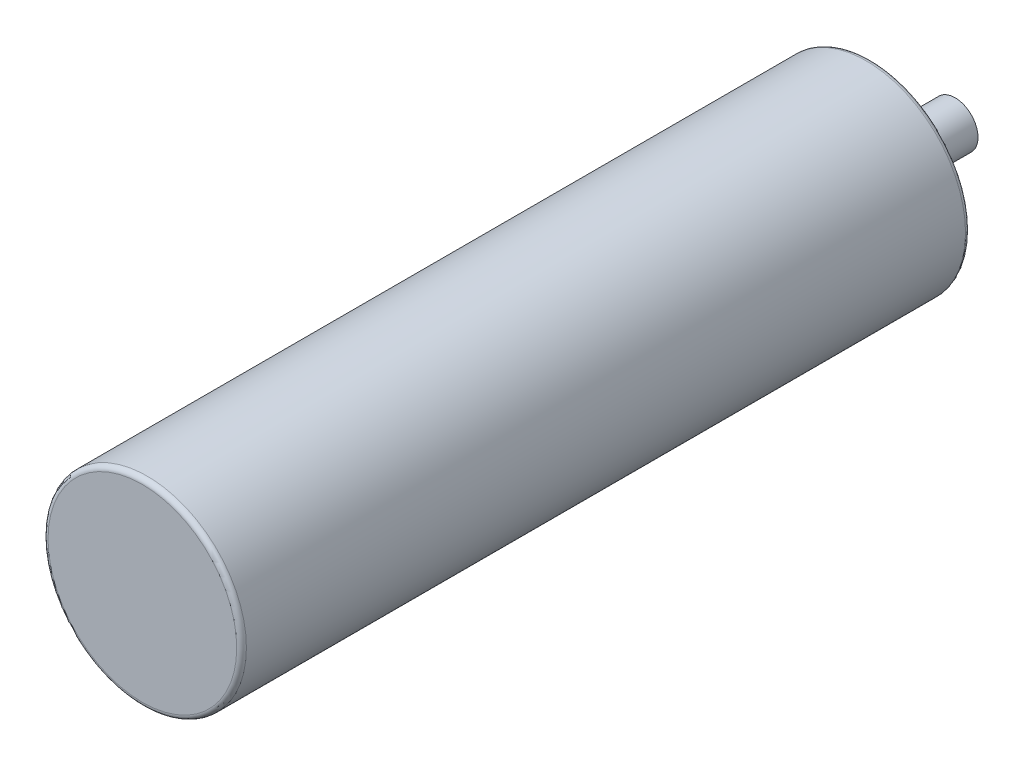
ISO-10303-21;
HEADER;
FILE_DESCRIPTION(('STEP AP214'),'2;1');
FILE_NAME('part.step','',(''),(''),'','','');
FILE_SCHEMA(('AUTOMOTIVE_DESIGN { 1 0 10303 214 1 1 1 1 }'));
ENDSEC;
DATA;
#1=APPLICATION_CONTEXT('core data for automotive mechanical design processes');
#2=APPLICATION_PROTOCOL_DEFINITION('international standard','automotive_design',2000,#1);
#3=PRODUCT_CONTEXT('',#1,'mechanical');
#4=PRODUCT('Part','Part','',(#3));
#5=PRODUCT_RELATED_PRODUCT_CATEGORY('part','',(#4));
#6=PRODUCT_DEFINITION_FORMATION('','',#4);
#7=PRODUCT_DEFINITION_CONTEXT('part definition',#1,'design');
#8=PRODUCT_DEFINITION('design','',#6,#7);
#9=PRODUCT_DEFINITION_SHAPE('','',#8);
#10=(LENGTH_UNIT() NAMED_UNIT(*) SI_UNIT(.MILLI.,.METRE.));
#11=(NAMED_UNIT(*) PLANE_ANGLE_UNIT() SI_UNIT($,.RADIAN.));
#12=(NAMED_UNIT(*) SI_UNIT($,.STERADIAN.) SOLID_ANGLE_UNIT());
#13=UNCERTAINTY_MEASURE_WITH_UNIT(LENGTH_MEASURE(1.E-05),#10,'distance_accuracy_value','');
#14=(GEOMETRIC_REPRESENTATION_CONTEXT(3) GLOBAL_UNCERTAINTY_ASSIGNED_CONTEXT((#13)) GLOBAL_UNIT_ASSIGNED_CONTEXT((#10,
#11,#12)) REPRESENTATION_CONTEXT('',''));
#15=CARTESIAN_POINT('',(0.,0.,0.));
#16=DIRECTION('',(0.,0.,1.));
#17=DIRECTION('',(1.,0.,0.));
#18=AXIS2_PLACEMENT_3D('',#15,#16,#17);
#19=CARTESIAN_POINT('',(0.,0.,-22.));
#20=DIRECTION('',(0.,0.,1.));
#21=DIRECTION('',(1.,0.,0.));
#22=AXIS2_PLACEMENT_3D('',#19,#20,#21);
#23=CYLINDRICAL_SURFACE('',#22,6.);
#24=CARTESIAN_POINT('',(0.,0.,0.));
#25=DIRECTION('',(0.,0.,1.));
#26=DIRECTION('',(1.,0.,0.));
#27=AXIS2_PLACEMENT_3D('',#24,#25,#26);
#28=CIRCLE('',#27,6.);
#29=CARTESIAN_POINT('',(6.,0.,0.));
#30=VERTEX_POINT('',#29);
#31=EDGE_CURVE('E125',#30,#30,#28,.F.);
#32=ORIENTED_EDGE('',*,*,#31,.T.);
#33=EDGE_LOOP('',(#32));
#34=FACE_BOUND('',#33,.T.);
#35=DIRECTION('',(0.,0.,-1.));
#36=VECTOR('',#35,1.);
#37=CARTESIAN_POINT('',(4.47213595499958,-4.,-7.));
#38=LINE('',#37,#36);
#39=CARTESIAN_POINT('',(4.47213595499958,-4.,-7.));
#40=VERTEX_POINT('',#39);
#41=CARTESIAN_POINT('',(4.47213595499958,-4.,-22.));
#42=VERTEX_POINT('',#41);
#43=EDGE_CURVE('E118',#40,#42,#38,.T.);
#44=ORIENTED_EDGE('',*,*,#43,.T.);
#45=CARTESIAN_POINT('',(0.,0.,-22.));
#46=DIRECTION('',(0.,0.,-1.));
#47=DIRECTION('',(-1.,0.,0.));
#48=AXIS2_PLACEMENT_3D('',#45,#46,#47);
#49=CIRCLE('',#48,6.);
#50=CARTESIAN_POINT('',(-4.47213595499958,-4.,-22.));
#51=VERTEX_POINT('',#50);
#52=EDGE_CURVE('E121',#51,#42,#49,.T.);
#53=ORIENTED_EDGE('',*,*,#52,.F.);
#54=DIRECTION('',(0.,0.,-1.));
#55=VECTOR('',#54,1.);
#56=CARTESIAN_POINT('',(-4.47213595499958,-4.,-7.));
#57=LINE('',#56,#55);
#58=CARTESIAN_POINT('',(-4.47213595499958,-4.,-7.));
#59=VERTEX_POINT('',#58);
#60=EDGE_CURVE('E50',#59,#51,#57,.T.);
#61=ORIENTED_EDGE('',*,*,#60,.F.);
#62=CARTESIAN_POINT('',(0.,0.,-7.));
#63=DIRECTION('',(0.,0.,-1.));
#64=DIRECTION('',(-1.,0.,0.));
#65=AXIS2_PLACEMENT_3D('',#62,#63,#64);
#66=CIRCLE('',#65,6.);
#67=EDGE_CURVE('E116',#40,#59,#66,.T.);
#68=ORIENTED_EDGE('',*,*,#67,.F.);
#69=EDGE_LOOP('',(#44,#53,#61,#68));
#70=FACE_BOUND('',#69,.T.);
#71=ADVANCED_FACE('F35',(#34,#70),#23,.T.);
#72=CARTESIAN_POINT('',(0.,0.,-22.));
#73=DIRECTION('',(0.,0.,-1.));
#74=DIRECTION('',(-1.,0.,0.));
#75=AXIS2_PLACEMENT_3D('',#72,#73,#74);
#76=PLANE('',#75);
#77=CARTESIAN_POINT('',(0.,0.,-22.));
#78=DIRECTION('',(0.,0.,-1.));
#79=DIRECTION('',(-1.,0.,0.));
#80=AXIS2_PLACEMENT_3D('',#77,#78,#79);
#81=CIRCLE('',#80,1.016);
#82=CARTESIAN_POINT('',(-1.016,0.,-22.));
#83=VERTEX_POINT('',#82);
#84=EDGE_CURVE('E109',#83,#83,#81,.T.);
#85=ORIENTED_EDGE('',*,*,#84,.F.);
#86=EDGE_LOOP('',(#85));
#87=FACE_BOUND('',#86,.T.);
#88=ORIENTED_EDGE('',*,*,#52,.T.);
#89=DIRECTION('',(-1.,0.,0.));
#90=VECTOR('',#89,1.);
#91=CARTESIAN_POINT('',(0.,-4.,-22.));
#92=LINE('',#91,#90);
#93=EDGE_CURVE('E62',#42,#51,#92,.T.);
#94=ORIENTED_EDGE('',*,*,#93,.T.);
#95=EDGE_LOOP('',(#88,#94));
#96=FACE_BOUND('',#95,.T.);
#97=ADVANCED_FACE('F155',(#87,#96),#76,.T.);
#98=CARTESIAN_POINT('',(0.,0.,191.));
#99=DIRECTION('',(0.,0.,-1.));
#100=DIRECTION('',(-1.,0.,0.));
#101=AXIS2_PLACEMENT_3D('',#98,#99,#100);
#102=CYLINDRICAL_SURFACE('',#101,26.);
#103=CARTESIAN_POINT('',(0.,0.,189.73));
#104=DIRECTION('',(0.,0.,1.));
#105=DIRECTION('',(1.,0.,0.));
#106=AXIS2_PLACEMENT_3D('',#103,#104,#105);
#107=CIRCLE('',#106,26.);
#108=CARTESIAN_POINT('',(26.,0.,189.73));
#109=VERTEX_POINT('',#108);
#110=EDGE_CURVE('E43',#109,#109,#107,.F.);
#111=ORIENTED_EDGE('',*,*,#110,.T.);
#112=EDGE_LOOP('',(#111));
#113=FACE_BOUND('',#112,.T.);
#114=CARTESIAN_POINT('',(0.,0.,1.26999999999999));
#115=DIRECTION('',(0.,0.,1.));
#116=DIRECTION('',(1.,0.,0.));
#117=AXIS2_PLACEMENT_3D('',#114,#115,#116);
#118=CIRCLE('',#117,26.);
#119=CARTESIAN_POINT('',(26.,0.,1.26999999999999));
#120=VERTEX_POINT('',#119);
#121=EDGE_CURVE('E131',#120,#120,#118,.T.);
#122=ORIENTED_EDGE('',*,*,#121,.T.);
#123=EDGE_LOOP('',(#122));
#124=FACE_BOUND('',#123,.T.);
#125=ADVANCED_FACE('F136',(#113,#124),#102,.T.);
#126=CARTESIAN_POINT('',(0.,0.,191.));
#127=DIRECTION('',(0.,0.,1.));
#128=DIRECTION('',(1.,0.,0.));
#129=AXIS2_PLACEMENT_3D('',#126,#127,#128);
#130=PLANE('',#129);
#131=CARTESIAN_POINT('',(0.,0.,191.));
#132=DIRECTION('',(0.,0.,1.));
#133=DIRECTION('',(1.,0.,0.));
#134=AXIS2_PLACEMENT_3D('',#131,#132,#133);
#135=CIRCLE('',#134,24.73);
#136=CARTESIAN_POINT('',(24.73,0.,191.));
#137=VERTEX_POINT('',#136);
#138=EDGE_CURVE('E128',#137,#137,#135,.T.);
#139=ORIENTED_EDGE('',*,*,#138,.T.);
#140=EDGE_LOOP('',(#139));
#141=FACE_BOUND('',#140,.T.);
#142=ADVANCED_FACE('F144',(#141),#130,.T.);
#143=CARTESIAN_POINT('',(0.,0.,0.));
#144=DIRECTION('',(0.,0.,1.));
#145=DIRECTION('',(1.,0.,0.));
#146=AXIS2_PLACEMENT_3D('',#143,#144,#145);
#147=PLANE('',#146);
#148=CARTESIAN_POINT('',(0.,0.,0.));
#149=DIRECTION('',(0.,0.,1.));
#150=DIRECTION('',(1.,0.,0.));
#151=AXIS2_PLACEMENT_3D('',#148,#149,#150);
#152=CIRCLE('',#151,24.73);
#153=CARTESIAN_POINT('',(24.73,0.,0.));
#154=VERTEX_POINT('',#153);
#155=EDGE_CURVE('E11',#154,#154,#152,.F.);
#156=ORIENTED_EDGE('',*,*,#155,.T.);
#157=EDGE_LOOP('',(#156));
#158=FACE_BOUND('',#157,.T.);
#159=CARTESIAN_POINT('',(0.,-20.,0.));
#160=DIRECTION('',(0.,0.,-1.));
#161=DIRECTION('',(-1.,0.,0.));
#162=AXIS2_PLACEMENT_3D('',#159,#160,#161);
#163=CIRCLE('',#162,2.09999999999999);
#164=CARTESIAN_POINT('',(-2.09999999999999,-20.,0.));
#165=VERTEX_POINT('',#164);
#166=EDGE_CURVE('E87',#165,#165,#163,.T.);
#167=ORIENTED_EDGE('',*,*,#166,.F.);
#168=EDGE_LOOP('',(#167));
#169=FACE_BOUND('',#168,.T.);
#170=CARTESIAN_POINT('',(20.,0.,0.));
#171=DIRECTION('',(0.,0.,-1.));
#172=DIRECTION('',(-1.,0.,0.));
#173=AXIS2_PLACEMENT_3D('',#170,#171,#172);
#174=CIRCLE('',#173,2.09999999999999);
#175=CARTESIAN_POINT('',(17.9,0.,0.));
#176=VERTEX_POINT('',#175);
#177=EDGE_CURVE('E86',#176,#176,#174,.T.);
#178=ORIENTED_EDGE('',*,*,#177,.F.);
#179=EDGE_LOOP('',(#178));
#180=FACE_BOUND('',#179,.T.);
#181=CARTESIAN_POINT('',(0.,20.,0.));
#182=DIRECTION('',(0.,0.,-1.));
#183=DIRECTION('',(-1.,0.,0.));
#184=AXIS2_PLACEMENT_3D('',#181,#182,#183);
#185=CIRCLE('',#184,2.09999999999999);
#186=CARTESIAN_POINT('',(-2.09999999999999,20.,0.));
#187=VERTEX_POINT('',#186);
#188=EDGE_CURVE('E97',#187,#187,#185,.T.);
#189=ORIENTED_EDGE('',*,*,#188,.F.);
#190=EDGE_LOOP('',(#189));
#191=FACE_BOUND('',#190,.T.);
#192=CARTESIAN_POINT('',(-20.,0.,0.));
#193=DIRECTION('',(0.,0.,-1.));
#194=DIRECTION('',(-1.,0.,0.));
#195=AXIS2_PLACEMENT_3D('',#192,#193,#194);
#196=CIRCLE('',#195,2.09999999999999);
#197=CARTESIAN_POINT('',(-22.1,0.,0.));
#198=VERTEX_POINT('',#197);
#199=EDGE_CURVE('E103',#198,#198,#196,.T.);
#200=ORIENTED_EDGE('',*,*,#199,.F.);
#201=EDGE_LOOP('',(#200));
#202=FACE_BOUND('',#201,.T.);
#203=ORIENTED_EDGE('',*,*,#31,.F.);
#204=EDGE_LOOP('',(#203));
#205=FACE_BOUND('',#204,.T.);
#206=ADVANCED_FACE('F146',(#158,#169,#180,#191,#202,#205),#147,.F.);
#207=CARTESIAN_POINT('',(0.,-4.,-7.));
#208=DIRECTION('',(0.,-1.,0.));
#209=DIRECTION('',(0.,0.,-1.));
#210=AXIS2_PLACEMENT_3D('',#207,#208,#209);
#211=PLANE('',#210);
#212=ORIENTED_EDGE('',*,*,#93,.F.);
#213=ORIENTED_EDGE('',*,*,#43,.F.);
#214=DIRECTION('',(-1.,0.,0.));
#215=VECTOR('',#214,1.);
#216=CARTESIAN_POINT('',(0.,-4.,-7.));
#217=LINE('',#216,#215);
#218=EDGE_CURVE('E56',#40,#59,#217,.T.);
#219=ORIENTED_EDGE('',*,*,#218,.T.);
#220=ORIENTED_EDGE('',*,*,#60,.T.);
#221=EDGE_LOOP('',(#212,#213,#219,#220));
#222=FACE_BOUND('',#221,.T.);
#223=ADVANCED_FACE('F152',(#222),#211,.T.);
#224=CARTESIAN_POINT('',(0.,0.,-7.));
#225=DIRECTION('',(0.,0.,-1.));
#226=DIRECTION('',(-1.,0.,0.));
#227=AXIS2_PLACEMENT_3D('',#224,#225,#226);
#228=PLANE('',#227);
#229=ORIENTED_EDGE('',*,*,#218,.F.);
#230=ORIENTED_EDGE('',*,*,#67,.T.);
#231=EDGE_LOOP('',(#229,#230));
#232=FACE_BOUND('',#231,.T.);
#233=ADVANCED_FACE('F169',(#232),#228,.T.);
#234=CARTESIAN_POINT('',(0.,0.,-7.));
#235=DIRECTION('',(0.,0.,-1.));
#236=DIRECTION('',(-1.,0.,0.));
#237=AXIS2_PLACEMENT_3D('',#234,#235,#236);
#238=CYLINDRICAL_SURFACE('',#237,1.016);
#239=CARTESIAN_POINT('',(0.,0.,-7.));
#240=DIRECTION('',(0.,0.,-1.));
#241=DIRECTION('',(-1.,0.,0.));
#242=AXIS2_PLACEMENT_3D('',#239,#240,#241);
#243=CIRCLE('',#242,1.016);
#244=CARTESIAN_POINT('',(-1.016,0.,-7.));
#245=VERTEX_POINT('',#244);
#246=EDGE_CURVE('E110',#245,#245,#243,.T.);
#247=ORIENTED_EDGE('',*,*,#246,.F.);
#248=EDGE_LOOP('',(#247));
#249=FACE_BOUND('',#248,.T.);
#250=ORIENTED_EDGE('',*,*,#84,.T.);
#251=EDGE_LOOP('',(#250));
#252=FACE_BOUND('',#251,.T.);
#253=ADVANCED_FACE('F172',(#249,#252),#238,.F.);
#254=CARTESIAN_POINT('',(0.,0.,-7.));
#255=DIRECTION('',(0.,0.,-1.));
#256=DIRECTION('',(-1.,0.,0.));
#257=AXIS2_PLACEMENT_3D('',#254,#255,#256);
#258=PLANE('',#257);
#259=ORIENTED_EDGE('',*,*,#246,.T.);
#260=EDGE_LOOP('',(#259));
#261=FACE_BOUND('',#260,.T.);
#262=ADVANCED_FACE('F176',(#261),#258,.T.);
#263=CARTESIAN_POINT('',(-20.,0.,32.0000122));
#264=DIRECTION('',(0.,0.,-1.));
#265=DIRECTION('',(-1.,0.,0.));
#266=AXIS2_PLACEMENT_3D('',#263,#264,#265);
#267=CONICAL_SURFACE('',#266,2.09999999999999,1.02974425867665);
#268=CARTESIAN_POINT('',(-20.,0.,33.2618194999579));
#269=VERTEX_POINT('',#268);
#270=VERTEX_LOOP('',#269);
#271=FACE_BOUND('',#270,.T.);
#272=CARTESIAN_POINT('',(-20.,0.,32.0000122));
#273=DIRECTION('',(0.,0.,-1.));
#274=DIRECTION('',(-1.,0.,0.));
#275=AXIS2_PLACEMENT_3D('',#272,#273,#274);
#276=CIRCLE('',#275,2.09999999999999);
#277=CARTESIAN_POINT('',(-22.1,0.,32.0000122));
#278=VERTEX_POINT('',#277);
#279=EDGE_CURVE('E106',#278,#278,#276,.T.);
#280=ORIENTED_EDGE('',*,*,#279,.T.);
#281=EDGE_LOOP('',(#280));
#282=FACE_BOUND('',#281,.T.);
#283=ADVANCED_FACE('F180',(#271,#282),#267,.F.);
#284=CARTESIAN_POINT('',(-20.,0.,0.));
#285=DIRECTION('',(0.,0.,-1.));
#286=DIRECTION('',(-1.,0.,0.));
#287=AXIS2_PLACEMENT_3D('',#284,#285,#286);
#288=CYLINDRICAL_SURFACE('',#287,2.09999999999999);
#289=ORIENTED_EDGE('',*,*,#279,.F.);
#290=EDGE_LOOP('',(#289));
#291=FACE_BOUND('',#290,.T.);
#292=ORIENTED_EDGE('',*,*,#199,.T.);
#293=EDGE_LOOP('',(#292));
#294=FACE_BOUND('',#293,.T.);
#295=ADVANCED_FACE('F184',(#291,#294),#288,.F.);
#296=CARTESIAN_POINT('',(0.,20.,32.0000122));
#297=DIRECTION('',(0.,0.,-1.));
#298=DIRECTION('',(-1.,0.,0.));
#299=AXIS2_PLACEMENT_3D('',#296,#297,#298);
#300=CONICAL_SURFACE('',#299,2.1,1.02974425867665);
#301=CARTESIAN_POINT('',(0.,20.,33.2618194999579));
#302=VERTEX_POINT('',#301);
#303=VERTEX_LOOP('',#302);
#304=FACE_BOUND('',#303,.T.);
#305=CARTESIAN_POINT('',(0.,20.,32.0000122));
#306=DIRECTION('',(0.,0.,-1.));
#307=DIRECTION('',(-1.,0.,0.));
#308=AXIS2_PLACEMENT_3D('',#305,#306,#307);
#309=CIRCLE('',#308,2.1);
#310=CARTESIAN_POINT('',(-2.1,20.,32.0000122));
#311=VERTEX_POINT('',#310);
#312=EDGE_CURVE('E100',#311,#311,#309,.T.);
#313=ORIENTED_EDGE('',*,*,#312,.T.);
#314=EDGE_LOOP('',(#313));
#315=FACE_BOUND('',#314,.T.);
#316=ADVANCED_FACE('F187',(#304,#315),#300,.F.);
#317=CARTESIAN_POINT('',(0.,20.,0.));
#318=DIRECTION('',(0.,0.,-1.));
#319=DIRECTION('',(-1.,0.,0.));
#320=AXIS2_PLACEMENT_3D('',#317,#318,#319);
#321=CYLINDRICAL_SURFACE('',#320,2.09999999999999);
#322=ORIENTED_EDGE('',*,*,#312,.F.);
#323=EDGE_LOOP('',(#322));
#324=FACE_BOUND('',#323,.T.);
#325=ORIENTED_EDGE('',*,*,#188,.T.);
#326=EDGE_LOOP('',(#325));
#327=FACE_BOUND('',#326,.T.);
#328=ADVANCED_FACE('F191',(#324,#327),#321,.F.);
#329=CARTESIAN_POINT('',(20.,0.,32.0000122));
#330=DIRECTION('',(0.,0.,-1.));
#331=DIRECTION('',(-1.,0.,0.));
#332=AXIS2_PLACEMENT_3D('',#329,#330,#331);
#333=CONICAL_SURFACE('',#332,2.09999999999999,1.02974425867665);
#334=CARTESIAN_POINT('',(20.,0.,33.2618194999579));
#335=VERTEX_POINT('',#334);
#336=VERTEX_LOOP('',#335);
#337=FACE_BOUND('',#336,.T.);
#338=CARTESIAN_POINT('',(20.,0.,32.0000122));
#339=DIRECTION('',(0.,0.,-1.));
#340=DIRECTION('',(-1.,0.,0.));
#341=AXIS2_PLACEMENT_3D('',#338,#339,#340);
#342=CIRCLE('',#341,2.09999999999999);
#343=CARTESIAN_POINT('',(17.9,0.,32.0000122));
#344=VERTEX_POINT('',#343);
#345=EDGE_CURVE('E90',#344,#344,#342,.T.);
#346=ORIENTED_EDGE('',*,*,#345,.T.);
#347=EDGE_LOOP('',(#346));
#348=FACE_BOUND('',#347,.T.);
#349=ADVANCED_FACE('F195',(#337,#348),#333,.F.);
#350=CARTESIAN_POINT('',(20.,0.,0.));
#351=DIRECTION('',(0.,0.,-1.));
#352=DIRECTION('',(-1.,0.,0.));
#353=AXIS2_PLACEMENT_3D('',#350,#351,#352);
#354=CYLINDRICAL_SURFACE('',#353,2.09999999999999);
#355=ORIENTED_EDGE('',*,*,#345,.F.);
#356=EDGE_LOOP('',(#355));
#357=FACE_BOUND('',#356,.T.);
#358=ORIENTED_EDGE('',*,*,#177,.T.);
#359=EDGE_LOOP('',(#358));
#360=FACE_BOUND('',#359,.T.);
#361=ADVANCED_FACE('F80',(#357,#360),#354,.F.);
#362=CARTESIAN_POINT('',(0.,-20.,32.0000122));
#363=DIRECTION('',(0.,0.,-1.));
#364=DIRECTION('',(-1.,0.,0.));
#365=AXIS2_PLACEMENT_3D('',#362,#363,#364);
#366=CONICAL_SURFACE('',#365,2.1,1.02974425867665);
#367=CARTESIAN_POINT('',(0.,-20.,33.2618194999579));
#368=VERTEX_POINT('',#367);
#369=VERTEX_LOOP('',#368);
#370=FACE_BOUND('',#369,.T.);
#371=CARTESIAN_POINT('',(0.,-20.,32.0000122));
#372=DIRECTION('',(0.,0.,-1.));
#373=DIRECTION('',(-1.,0.,0.));
#374=AXIS2_PLACEMENT_3D('',#371,#372,#373);
#375=CIRCLE('',#374,2.1);
#376=CARTESIAN_POINT('',(-2.1,-20.,32.0000122));
#377=VERTEX_POINT('',#376);
#378=EDGE_CURVE('E84',#377,#377,#375,.T.);
#379=ORIENTED_EDGE('',*,*,#378,.T.);
#380=EDGE_LOOP('',(#379));
#381=FACE_BOUND('',#380,.T.);
#382=ADVANCED_FACE('F76',(#370,#381),#366,.F.);
#383=CARTESIAN_POINT('',(0.,-20.,0.));
#384=DIRECTION('',(0.,0.,-1.));
#385=DIRECTION('',(-1.,0.,0.));
#386=AXIS2_PLACEMENT_3D('',#383,#384,#385);
#387=CYLINDRICAL_SURFACE('',#386,2.09999999999999);
#388=ORIENTED_EDGE('',*,*,#378,.F.);
#389=EDGE_LOOP('',(#388));
#390=FACE_BOUND('',#389,.T.);
#391=ORIENTED_EDGE('',*,*,#166,.T.);
#392=EDGE_LOOP('',(#391));
#393=FACE_BOUND('',#392,.T.);
#394=ADVANCED_FACE('F79',(#390,#393),#387,.F.);
#395=CARTESIAN_POINT('',(0.,0.,189.73));
#396=DIRECTION('',(0.,0.,1.));
#397=DIRECTION('',(1.,0.,0.));
#398=AXIS2_PLACEMENT_3D('',#395,#396,#397);
#399=TOROIDAL_SURFACE('',#398,24.73,1.27);
#400=ORIENTED_EDGE('',*,*,#110,.F.);
#401=EDGE_LOOP('',(#400));
#402=FACE_BOUND('',#401,.T.);
#403=ORIENTED_EDGE('',*,*,#138,.F.);
#404=EDGE_LOOP('',(#403));
#405=FACE_BOUND('',#404,.T.);
#406=ADVANCED_FACE('F139',(#402,#405),#399,.T.);
#407=CARTESIAN_POINT('',(0.,0.,1.26999999999999));
#408=DIRECTION('',(0.,0.,1.));
#409=DIRECTION('',(1.,0.,0.));
#410=AXIS2_PLACEMENT_3D('',#407,#408,#409);
#411=TOROIDAL_SURFACE('',#410,24.73,1.27);
#412=ORIENTED_EDGE('',*,*,#155,.F.);
#413=EDGE_LOOP('',(#412));
#414=FACE_BOUND('',#413,.T.);
#415=ORIENTED_EDGE('',*,*,#121,.F.);
#416=EDGE_LOOP('',(#415));
#417=FACE_BOUND('',#416,.T.);
#418=ADVANCED_FACE('F37',(#414,#417),#411,.T.);
#419=CLOSED_SHELL('',(#71,#97,#125,#142,#206,#223,#233,#253,#262,#283,#295,#316,#328,#349,#361,
#382,#394,#406,#418));
#420=MANIFOLD_SOLID_BREP('B2',#419);
#421=ADVANCED_BREP_SHAPE_REPRESENTATION('',(#18,#420),#14);
#422=SHAPE_DEFINITION_REPRESENTATION(#9,#421);
ENDSEC;
END-ISO-10303-21;
